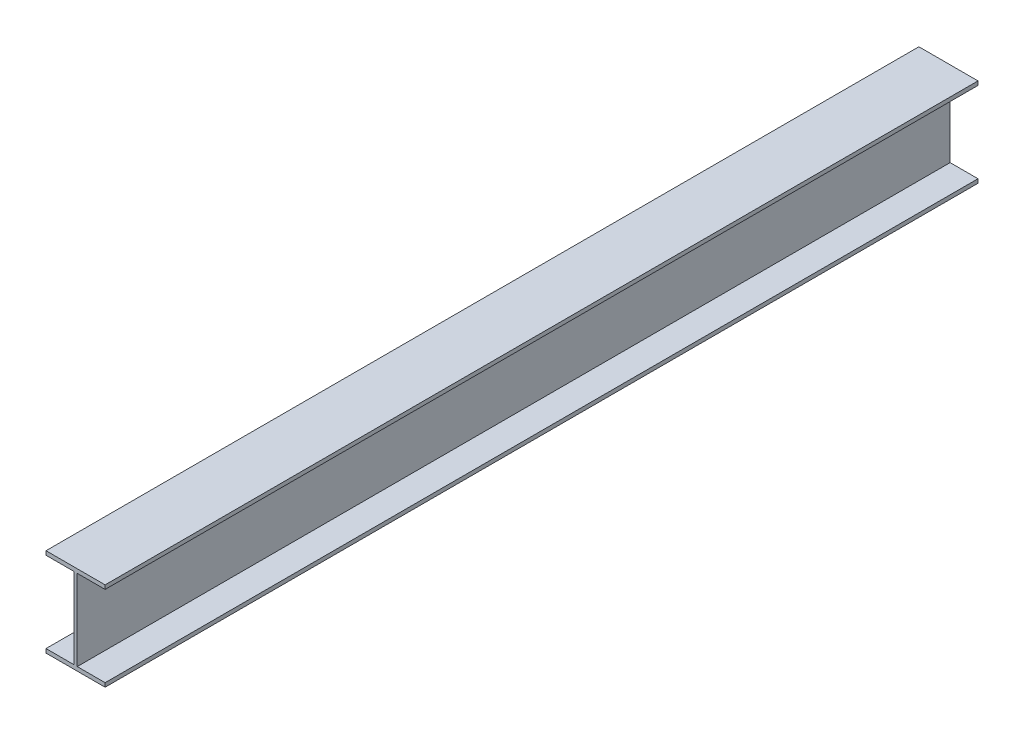
ISO-10303-21;
HEADER;
FILE_DESCRIPTION(('STEP AP214'),'2;1');
FILE_NAME('part.step','',(''),(''),'','','');
FILE_SCHEMA(('AUTOMOTIVE_DESIGN { 1 0 10303 214 1 1 1 1 }'));
ENDSEC;
DATA;
#1=APPLICATION_CONTEXT('core data for automotive mechanical design processes');
#2=APPLICATION_PROTOCOL_DEFINITION('international standard','automotive_design',2000,#1);
#3=PRODUCT_CONTEXT('',#1,'mechanical');
#4=PRODUCT('Part','Part','',(#3));
#5=PRODUCT_RELATED_PRODUCT_CATEGORY('part','',(#4));
#6=PRODUCT_DEFINITION_FORMATION('','',#4);
#7=PRODUCT_DEFINITION_CONTEXT('part definition',#1,'design');
#8=PRODUCT_DEFINITION('design','',#6,#7);
#9=PRODUCT_DEFINITION_SHAPE('','',#8);
#10=(LENGTH_UNIT() NAMED_UNIT(*) SI_UNIT(.MILLI.,.METRE.));
#11=(NAMED_UNIT(*) PLANE_ANGLE_UNIT() SI_UNIT($,.RADIAN.));
#12=(NAMED_UNIT(*) SI_UNIT($,.STERADIAN.) SOLID_ANGLE_UNIT());
#13=UNCERTAINTY_MEASURE_WITH_UNIT(LENGTH_MEASURE(1.E-05),#10,'distance_accuracy_value','');
#14=(GEOMETRIC_REPRESENTATION_CONTEXT(3) GLOBAL_UNCERTAINTY_ASSIGNED_CONTEXT((#13)) GLOBAL_UNIT_ASSIGNED_CONTEXT((#10,
#11,#12)) REPRESENTATION_CONTEXT('',''));
#15=CARTESIAN_POINT('',(0.,0.,0.));
#16=DIRECTION('',(0.,0.,1.));
#17=DIRECTION('',(1.,0.,0.));
#18=AXIS2_PLACEMENT_3D('',#15,#16,#17);
#19=CARTESIAN_POINT('',(0.,0.,1500.));
#20=DIRECTION('',(1.,0.,0.));
#21=DIRECTION('',(0.,1.,0.));
#22=AXIS2_PLACEMENT_3D('',#19,#20,#21);
#23=PLANE('',#22);
#24=DIRECTION('',(0.,-1.,0.));
#25=VECTOR('',#24,1.);
#26=CARTESIAN_POINT('',(0.,0.,0.));
#27=LINE('',#26,#25);
#28=CARTESIAN_POINT('',(0.,0.,0.));
#29=VERTEX_POINT('',#28);
#30=CARTESIAN_POINT('',(0.,-6.8,0.));
#31=VERTEX_POINT('',#30);
#32=EDGE_CURVE('E156',#29,#31,#27,.T.);
#33=ORIENTED_EDGE('',*,*,#32,.T.);
#34=DIRECTION('',(0.,0.,-1.));
#35=VECTOR('',#34,1.);
#36=CARTESIAN_POINT('',(0.,-6.8,1500.));
#37=LINE('',#36,#35);
#38=CARTESIAN_POINT('',(0.,-6.8,1500.));
#39=VERTEX_POINT('',#38);
#40=EDGE_CURVE('E11',#39,#31,#37,.T.);
#41=ORIENTED_EDGE('',*,*,#40,.F.);
#42=DIRECTION('',(0.,-1.,0.));
#43=VECTOR('',#42,1.);
#44=CARTESIAN_POINT('',(0.,0.,1500.));
#45=LINE('',#44,#43);
#46=CARTESIAN_POINT('',(0.,0.,1500.));
#47=VERTEX_POINT('',#46);
#48=EDGE_CURVE('E178',#47,#39,#45,.T.);
#49=ORIENTED_EDGE('',*,*,#48,.F.);
#50=DIRECTION('',(0.,0.,-1.));
#51=VECTOR('',#50,1.);
#52=CARTESIAN_POINT('',(0.,0.,1500.));
#53=LINE('',#52,#51);
#54=EDGE_CURVE('E152',#47,#29,#53,.T.);
#55=ORIENTED_EDGE('',*,*,#54,.T.);
#56=EDGE_LOOP('',(#33,#41,#49,#55));
#57=FACE_BOUND('',#56,.T.);
#58=ADVANCED_FACE('F36',(#57),#23,.F.);
#59=CARTESIAN_POINT('',(0.,-6.8,1500.));
#60=DIRECTION('',(0.,1.,0.));
#61=DIRECTION('',(0.,0.,1.));
#62=AXIS2_PLACEMENT_3D('',#59,#60,#61);
#63=PLANE('',#62);
#64=DIRECTION('',(1.,0.,0.));
#65=VECTOR('',#64,1.);
#66=CARTESIAN_POINT('',(0.,-6.8,0.));
#67=LINE('',#66,#65);
#68=CARTESIAN_POINT('',(47.9,-6.8,0.));
#69=VERTEX_POINT('',#68);
#70=EDGE_CURVE('E159',#31,#69,#67,.T.);
#71=ORIENTED_EDGE('',*,*,#70,.T.);
#72=DIRECTION('',(0.,0.,-1.));
#73=VECTOR('',#72,1.);
#74=CARTESIAN_POINT('',(47.9,-6.8,1500.));
#75=LINE('',#74,#73);
#76=CARTESIAN_POINT('',(47.9,-6.8,1500.));
#77=VERTEX_POINT('',#76);
#78=EDGE_CURVE('E44',#77,#69,#75,.T.);
#79=ORIENTED_EDGE('',*,*,#78,.F.);
#80=DIRECTION('',(1.,0.,0.));
#81=VECTOR('',#80,1.);
#82=CARTESIAN_POINT('',(0.,-6.8,1500.));
#83=LINE('',#82,#81);
#84=EDGE_CURVE('E107',#39,#77,#83,.T.);
#85=ORIENTED_EDGE('',*,*,#84,.F.);
#86=ORIENTED_EDGE('',*,*,#40,.T.);
#87=EDGE_LOOP('',(#71,#79,#85,#86));
#88=FACE_BOUND('',#87,.T.);
#89=ADVANCED_FACE('F256',(#88),#63,.F.);
#90=CARTESIAN_POINT('',(47.9,-6.8,1500.));
#91=DIRECTION('',(1.,0.,0.));
#92=DIRECTION('',(0.,1.,0.));
#93=AXIS2_PLACEMENT_3D('',#90,#91,#92);
#94=PLANE('',#93);
#95=DIRECTION('',(0.,-1.,0.));
#96=VECTOR('',#95,1.);
#97=CARTESIAN_POINT('',(47.9,-6.8,0.));
#98=LINE('',#97,#96);
#99=CARTESIAN_POINT('',(47.9,-145.6,0.));
#100=VERTEX_POINT('',#99);
#101=EDGE_CURVE('E161',#69,#100,#98,.T.);
#102=ORIENTED_EDGE('',*,*,#101,.T.);
#103=DIRECTION('',(0.,0.,-1.));
#104=VECTOR('',#103,1.);
#105=CARTESIAN_POINT('',(47.9,-145.6,1500.));
#106=LINE('',#105,#104);
#107=CARTESIAN_POINT('',(47.9,-145.6,1500.));
#108=VERTEX_POINT('',#107);
#109=EDGE_CURVE('E197',#108,#100,#106,.T.);
#110=ORIENTED_EDGE('',*,*,#109,.F.);
#111=DIRECTION('',(0.,-1.,0.));
#112=VECTOR('',#111,1.);
#113=CARTESIAN_POINT('',(47.9,-6.8,1500.));
#114=LINE('',#113,#112);
#115=EDGE_CURVE('E205',#77,#108,#114,.T.);
#116=ORIENTED_EDGE('',*,*,#115,.F.);
#117=ORIENTED_EDGE('',*,*,#78,.T.);
#118=EDGE_LOOP('',(#102,#110,#116,#117));
#119=FACE_BOUND('',#118,.T.);
#120=ADVANCED_FACE('F203',(#119),#94,.F.);
#121=CARTESIAN_POINT('',(47.9,-145.6,1500.));
#122=DIRECTION('',(0.,-1.,0.));
#123=DIRECTION('',(0.,0.,-1.));
#124=AXIS2_PLACEMENT_3D('',#121,#122,#123);
#125=PLANE('',#124);
#126=DIRECTION('',(-1.,0.,0.));
#127=VECTOR('',#126,1.);
#128=CARTESIAN_POINT('',(47.9,-145.6,0.));
#129=LINE('',#128,#127);
#130=CARTESIAN_POINT('',(0.,-145.6,0.));
#131=VERTEX_POINT('',#130);
#132=EDGE_CURVE('E163',#100,#131,#129,.T.);
#133=ORIENTED_EDGE('',*,*,#132,.T.);
#134=DIRECTION('',(0.,0.,-1.));
#135=VECTOR('',#134,1.);
#136=CARTESIAN_POINT('',(0.,-145.6,1500.));
#137=LINE('',#136,#135);
#138=CARTESIAN_POINT('',(0.,-145.6,1500.));
#139=VERTEX_POINT('',#138);
#140=EDGE_CURVE('E194',#139,#131,#137,.T.);
#141=ORIENTED_EDGE('',*,*,#140,.F.);
#142=DIRECTION('',(-1.,0.,0.));
#143=VECTOR('',#142,1.);
#144=CARTESIAN_POINT('',(47.9,-145.6,1500.));
#145=LINE('',#144,#143);
#146=EDGE_CURVE('E223',#108,#139,#145,.T.);
#147=ORIENTED_EDGE('',*,*,#146,.F.);
#148=ORIENTED_EDGE('',*,*,#109,.T.);
#149=EDGE_LOOP('',(#133,#141,#147,#148));
#150=FACE_BOUND('',#149,.T.);
#151=ADVANCED_FACE('F214',(#150),#125,.F.);
#152=CARTESIAN_POINT('',(0.,-145.6,1500.));
#153=DIRECTION('',(1.,0.,0.));
#154=DIRECTION('',(0.,1.,0.));
#155=AXIS2_PLACEMENT_3D('',#152,#153,#154);
#156=PLANE('',#155);
#157=DIRECTION('',(0.,-1.,0.));
#158=VECTOR('',#157,1.);
#159=CARTESIAN_POINT('',(0.,-145.6,0.));
#160=LINE('',#159,#158);
#161=CARTESIAN_POINT('',(0.,-152.4,0.));
#162=VERTEX_POINT('',#161);
#163=EDGE_CURVE('E165',#131,#162,#160,.T.);
#164=ORIENTED_EDGE('',*,*,#163,.T.);
#165=DIRECTION('',(0.,0.,-1.));
#166=VECTOR('',#165,1.);
#167=CARTESIAN_POINT('',(0.,-152.4,1500.));
#168=LINE('',#167,#166);
#169=CARTESIAN_POINT('',(0.,-152.4,1500.));
#170=VERTEX_POINT('',#169);
#171=EDGE_CURVE('E191',#170,#162,#168,.T.);
#172=ORIENTED_EDGE('',*,*,#171,.F.);
#173=DIRECTION('',(0.,-1.,0.));
#174=VECTOR('',#173,1.);
#175=CARTESIAN_POINT('',(0.,-145.6,1500.));
#176=LINE('',#175,#174);
#177=EDGE_CURVE('E220',#139,#170,#176,.T.);
#178=ORIENTED_EDGE('',*,*,#177,.F.);
#179=ORIENTED_EDGE('',*,*,#140,.T.);
#180=EDGE_LOOP('',(#164,#172,#178,#179));
#181=FACE_BOUND('',#180,.T.);
#182=ADVANCED_FACE('F218',(#181),#156,.F.);
#183=CARTESIAN_POINT('',(0.,-152.4,1500.));
#184=DIRECTION('',(0.,1.,0.));
#185=DIRECTION('',(0.,0.,1.));
#186=AXIS2_PLACEMENT_3D('',#183,#184,#185);
#187=PLANE('',#186);
#188=DIRECTION('',(1.,0.,0.));
#189=VECTOR('',#188,1.);
#190=CARTESIAN_POINT('',(0.,-152.4,0.));
#191=LINE('',#190,#189);
#192=CARTESIAN_POINT('',(101.6,-152.4,0.));
#193=VERTEX_POINT('',#192);
#194=EDGE_CURVE('E167',#162,#193,#191,.T.);
#195=ORIENTED_EDGE('',*,*,#194,.T.);
#196=DIRECTION('',(0.,0.,-1.));
#197=VECTOR('',#196,1.);
#198=CARTESIAN_POINT('',(101.6,-152.4,1500.));
#199=LINE('',#198,#197);
#200=CARTESIAN_POINT('',(101.6,-152.4,1500.));
#201=VERTEX_POINT('',#200);
#202=EDGE_CURVE('E188',#201,#193,#199,.T.);
#203=ORIENTED_EDGE('',*,*,#202,.F.);
#204=DIRECTION('',(1.,0.,0.));
#205=VECTOR('',#204,1.);
#206=CARTESIAN_POINT('',(0.,-152.4,1500.));
#207=LINE('',#206,#205);
#208=EDGE_CURVE('E222',#170,#201,#207,.T.);
#209=ORIENTED_EDGE('',*,*,#208,.F.);
#210=ORIENTED_EDGE('',*,*,#171,.T.);
#211=EDGE_LOOP('',(#195,#203,#209,#210));
#212=FACE_BOUND('',#211,.T.);
#213=ADVANCED_FACE('F269',(#212),#187,.F.);
#214=CARTESIAN_POINT('',(101.6,-145.6,1500.));
#215=DIRECTION('',(-1.,0.,0.));
#216=DIRECTION('',(0.,0.,1.));
#217=AXIS2_PLACEMENT_3D('',#214,#215,#216);
#218=PLANE('',#217);
#219=DIRECTION('',(0.,1.,0.));
#220=VECTOR('',#219,1.);
#221=CARTESIAN_POINT('',(101.6,-145.6,0.));
#222=LINE('',#221,#220);
#223=CARTESIAN_POINT('',(101.6,-145.6,0.));
#224=VERTEX_POINT('',#223);
#225=EDGE_CURVE('E169',#193,#224,#222,.T.);
#226=ORIENTED_EDGE('',*,*,#225,.T.);
#227=DIRECTION('',(0.,0.,-1.));
#228=VECTOR('',#227,1.);
#229=CARTESIAN_POINT('',(101.6,-145.6,1500.));
#230=LINE('',#229,#228);
#231=CARTESIAN_POINT('',(101.6,-145.6,1500.));
#232=VERTEX_POINT('',#231);
#233=EDGE_CURVE('E185',#232,#224,#230,.T.);
#234=ORIENTED_EDGE('',*,*,#233,.F.);
#235=DIRECTION('',(0.,1.,0.));
#236=VECTOR('',#235,1.);
#237=CARTESIAN_POINT('',(101.6,-145.6,1500.));
#238=LINE('',#237,#236);
#239=EDGE_CURVE('E225',#201,#232,#238,.T.);
#240=ORIENTED_EDGE('',*,*,#239,.F.);
#241=ORIENTED_EDGE('',*,*,#202,.T.);
#242=EDGE_LOOP('',(#226,#234,#240,#241));
#243=FACE_BOUND('',#242,.T.);
#244=ADVANCED_FACE('F272',(#243),#218,.F.);
#245=CARTESIAN_POINT('',(53.7,-145.6,1500.));
#246=DIRECTION('',(0.,-1.,0.));
#247=DIRECTION('',(0.,0.,-1.));
#248=AXIS2_PLACEMENT_3D('',#245,#246,#247);
#249=PLANE('',#248);
#250=DIRECTION('',(-1.,0.,0.));
#251=VECTOR('',#250,1.);
#252=CARTESIAN_POINT('',(53.7,-145.6,0.));
#253=LINE('',#252,#251);
#254=CARTESIAN_POINT('',(53.7,-145.6,0.));
#255=VERTEX_POINT('',#254);
#256=EDGE_CURVE('E171',#224,#255,#253,.T.);
#257=ORIENTED_EDGE('',*,*,#256,.T.);
#258=DIRECTION('',(0.,0.,-1.));
#259=VECTOR('',#258,1.);
#260=CARTESIAN_POINT('',(53.7,-145.6,1500.));
#261=LINE('',#260,#259);
#262=CARTESIAN_POINT('',(53.7,-145.6,1500.));
#263=VERTEX_POINT('',#262);
#264=EDGE_CURVE('E182',#263,#255,#261,.T.);
#265=ORIENTED_EDGE('',*,*,#264,.F.);
#266=DIRECTION('',(-1.,0.,0.));
#267=VECTOR('',#266,1.);
#268=CARTESIAN_POINT('',(53.7,-145.6,1500.));
#269=LINE('',#268,#267);
#270=EDGE_CURVE('E231',#232,#263,#269,.T.);
#271=ORIENTED_EDGE('',*,*,#270,.F.);
#272=ORIENTED_EDGE('',*,*,#233,.T.);
#273=EDGE_LOOP('',(#257,#265,#271,#272));
#274=FACE_BOUND('',#273,.T.);
#275=ADVANCED_FACE('F237',(#274),#249,.F.);
#276=CARTESIAN_POINT('',(53.7,-6.8,1500.));
#277=DIRECTION('',(-1.,0.,0.));
#278=DIRECTION('',(0.,-1.,0.));
#279=AXIS2_PLACEMENT_3D('',#276,#277,#278);
#280=PLANE('',#279);
#281=DIRECTION('',(0.,1.,0.));
#282=VECTOR('',#281,1.);
#283=CARTESIAN_POINT('',(53.7,-6.8,0.));
#284=LINE('',#283,#282);
#285=CARTESIAN_POINT('',(53.7,-6.8,0.));
#286=VERTEX_POINT('',#285);
#287=EDGE_CURVE('E173',#255,#286,#284,.T.);
#288=ORIENTED_EDGE('',*,*,#287,.T.);
#289=DIRECTION('',(0.,0.,-1.));
#290=VECTOR('',#289,1.);
#291=CARTESIAN_POINT('',(53.7,-6.8,1500.));
#292=LINE('',#291,#290);
#293=CARTESIAN_POINT('',(53.7,-6.8,1500.));
#294=VERTEX_POINT('',#293);
#295=EDGE_CURVE('E147',#294,#286,#292,.T.);
#296=ORIENTED_EDGE('',*,*,#295,.F.);
#297=DIRECTION('',(0.,1.,0.));
#298=VECTOR('',#297,1.);
#299=CARTESIAN_POINT('',(53.7,-6.8,1500.));
#300=LINE('',#299,#298);
#301=EDGE_CURVE('E138',#263,#294,#300,.T.);
#302=ORIENTED_EDGE('',*,*,#301,.F.);
#303=ORIENTED_EDGE('',*,*,#264,.T.);
#304=EDGE_LOOP('',(#288,#296,#302,#303));
#305=FACE_BOUND('',#304,.T.);
#306=ADVANCED_FACE('F241',(#305),#280,.F.);
#307=CARTESIAN_POINT('',(101.6,-6.79999999999999,1500.));
#308=DIRECTION('',(0.,1.,0.));
#309=DIRECTION('',(-1.,0.,0.));
#310=AXIS2_PLACEMENT_3D('',#307,#308,#309);
#311=PLANE('',#310);
#312=DIRECTION('',(1.,0.,0.));
#313=VECTOR('',#312,1.);
#314=CARTESIAN_POINT('',(101.6,-6.79999999999999,0.));
#315=LINE('',#314,#313);
#316=CARTESIAN_POINT('',(101.6,-6.79999999999999,0.));
#317=VERTEX_POINT('',#316);
#318=EDGE_CURVE('E146',#286,#317,#315,.T.);
#319=ORIENTED_EDGE('',*,*,#318,.T.);
#320=DIRECTION('',(0.,0.,-1.));
#321=VECTOR('',#320,1.);
#322=CARTESIAN_POINT('',(101.6,-6.79999999999999,1500.));
#323=LINE('',#322,#321);
#324=CARTESIAN_POINT('',(101.6,-6.79999999999999,1500.));
#325=VERTEX_POINT('',#324);
#326=EDGE_CURVE('E143',#325,#317,#323,.T.);
#327=ORIENTED_EDGE('',*,*,#326,.F.);
#328=DIRECTION('',(1.,0.,0.));
#329=VECTOR('',#328,1.);
#330=CARTESIAN_POINT('',(101.6,-6.79999999999999,1500.));
#331=LINE('',#330,#329);
#332=EDGE_CURVE('E132',#294,#325,#331,.T.);
#333=ORIENTED_EDGE('',*,*,#332,.F.);
#334=ORIENTED_EDGE('',*,*,#295,.T.);
#335=EDGE_LOOP('',(#319,#327,#333,#334));
#336=FACE_BOUND('',#335,.T.);
#337=ADVANCED_FACE('F144',(#336),#311,.F.);
#338=CARTESIAN_POINT('',(101.6,0.,1500.));
#339=DIRECTION('',(-1.,0.,0.));
#340=DIRECTION('',(0.,0.,1.));
#341=AXIS2_PLACEMENT_3D('',#338,#339,#340);
#342=PLANE('',#341);
#343=DIRECTION('',(0.,1.,0.));
#344=VECTOR('',#343,1.);
#345=CARTESIAN_POINT('',(101.6,0.,0.));
#346=LINE('',#345,#344);
#347=CARTESIAN_POINT('',(101.6,0.,0.));
#348=VERTEX_POINT('',#347);
#349=EDGE_CURVE('E93',#317,#348,#346,.T.);
#350=ORIENTED_EDGE('',*,*,#349,.T.);
#351=DIRECTION('',(0.,0.,-1.));
#352=VECTOR('',#351,1.);
#353=CARTESIAN_POINT('',(101.6,0.,1500.));
#354=LINE('',#353,#352);
#355=CARTESIAN_POINT('',(101.6,0.,1500.));
#356=VERTEX_POINT('',#355);
#357=EDGE_CURVE('E148',#356,#348,#354,.T.);
#358=ORIENTED_EDGE('',*,*,#357,.F.);
#359=DIRECTION('',(0.,1.,0.));
#360=VECTOR('',#359,1.);
#361=CARTESIAN_POINT('',(101.6,0.,1500.));
#362=LINE('',#361,#360);
#363=EDGE_CURVE('E136',#325,#356,#362,.T.);
#364=ORIENTED_EDGE('',*,*,#363,.F.);
#365=ORIENTED_EDGE('',*,*,#326,.T.);
#366=EDGE_LOOP('',(#350,#358,#364,#365));
#367=FACE_BOUND('',#366,.T.);
#368=ADVANCED_FACE('F150',(#367),#342,.F.);
#369=CARTESIAN_POINT('',(0.,0.,1500.));
#370=DIRECTION('',(0.,-1.,0.));
#371=DIRECTION('',(1.,0.,0.));
#372=AXIS2_PLACEMENT_3D('',#369,#370,#371);
#373=PLANE('',#372);
#374=DIRECTION('',(-1.,0.,0.));
#375=VECTOR('',#374,1.);
#376=CARTESIAN_POINT('',(0.,0.,0.));
#377=LINE('',#376,#375);
#378=EDGE_CURVE('E99',#348,#29,#377,.T.);
#379=ORIENTED_EDGE('',*,*,#378,.T.);
#380=ORIENTED_EDGE('',*,*,#54,.F.);
#381=DIRECTION('',(-1.,0.,0.));
#382=VECTOR('',#381,1.);
#383=CARTESIAN_POINT('',(0.,0.,1500.));
#384=LINE('',#383,#382);
#385=EDGE_CURVE('E52',#356,#47,#384,.T.);
#386=ORIENTED_EDGE('',*,*,#385,.F.);
#387=ORIENTED_EDGE('',*,*,#357,.T.);
#388=EDGE_LOOP('',(#379,#380,#386,#387));
#389=FACE_BOUND('',#388,.T.);
#390=ADVANCED_FACE('F245',(#389),#373,.F.);
#391=CARTESIAN_POINT('',(0.,0.,1500.));
#392=DIRECTION('',(0.,0.,1.));
#393=DIRECTION('',(1.,0.,0.));
#394=AXIS2_PLACEMENT_3D('',#391,#392,#393);
#395=PLANE('',#394);
#396=ORIENTED_EDGE('',*,*,#48,.T.);
#397=ORIENTED_EDGE('',*,*,#84,.T.);
#398=ORIENTED_EDGE('',*,*,#115,.T.);
#399=ORIENTED_EDGE('',*,*,#146,.T.);
#400=ORIENTED_EDGE('',*,*,#177,.T.);
#401=ORIENTED_EDGE('',*,*,#208,.T.);
#402=ORIENTED_EDGE('',*,*,#239,.T.);
#403=ORIENTED_EDGE('',*,*,#270,.T.);
#404=ORIENTED_EDGE('',*,*,#301,.T.);
#405=ORIENTED_EDGE('',*,*,#332,.T.);
#406=ORIENTED_EDGE('',*,*,#363,.T.);
#407=ORIENTED_EDGE('',*,*,#385,.T.);
#408=EDGE_LOOP('',(#396,#397,#398,#399,#400,#401,#402,#403,#404,#405,#406,#407));
#409=FACE_BOUND('',#408,.T.);
#410=ADVANCED_FACE('F134',(#409),#395,.T.);
#411=CARTESIAN_POINT('',(0.,0.,0.));
#412=DIRECTION('',(0.,0.,1.));
#413=DIRECTION('',(1.,0.,0.));
#414=AXIS2_PLACEMENT_3D('',#411,#412,#413);
#415=PLANE('',#414);
#416=ORIENTED_EDGE('',*,*,#32,.F.);
#417=ORIENTED_EDGE('',*,*,#378,.F.);
#418=ORIENTED_EDGE('',*,*,#349,.F.);
#419=ORIENTED_EDGE('',*,*,#318,.F.);
#420=ORIENTED_EDGE('',*,*,#287,.F.);
#421=ORIENTED_EDGE('',*,*,#256,.F.);
#422=ORIENTED_EDGE('',*,*,#225,.F.);
#423=ORIENTED_EDGE('',*,*,#194,.F.);
#424=ORIENTED_EDGE('',*,*,#163,.F.);
#425=ORIENTED_EDGE('',*,*,#132,.F.);
#426=ORIENTED_EDGE('',*,*,#101,.F.);
#427=ORIENTED_EDGE('',*,*,#70,.F.);
#428=EDGE_LOOP('',(#416,#417,#418,#419,#420,#421,#422,#423,#424,#425,#426,#427));
#429=FACE_BOUND('',#428,.T.);
#430=ADVANCED_FACE('F209',(#429),#415,.F.);
#431=CLOSED_SHELL('',(#58,#89,#120,#151,#182,#213,#244,#275,#306,#337,#368,#390,#410,#430));
#432=MANIFOLD_SOLID_BREP('B2',#431);
#433=ADVANCED_BREP_SHAPE_REPRESENTATION('',(#18,#432),#14);
#434=SHAPE_DEFINITION_REPRESENTATION(#9,#433);
ENDSEC;
END-ISO-10303-21;
